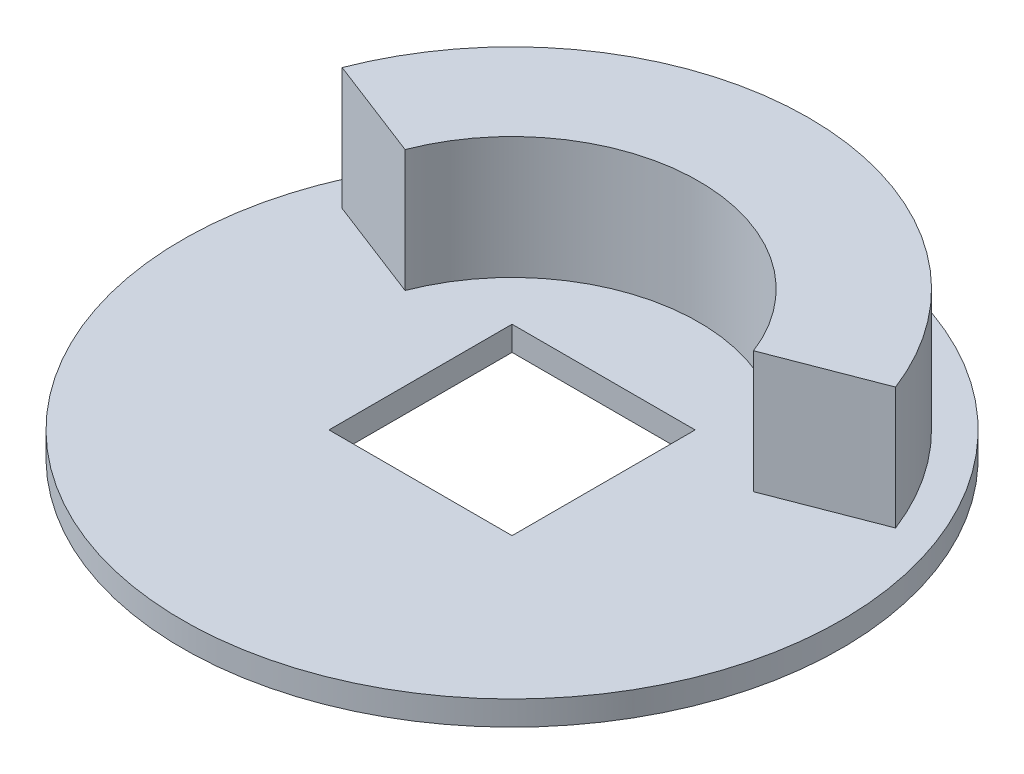
ISO-10303-21;
HEADER;
FILE_DESCRIPTION(('STEP AP214'),'2;1');
FILE_NAME('part.step','',(''),(''),'','','');
FILE_SCHEMA(('AUTOMOTIVE_DESIGN { 1 0 10303 214 1 1 1 1 }'));
ENDSEC;
DATA;
#1=APPLICATION_CONTEXT('core data for automotive mechanical design processes');
#2=APPLICATION_PROTOCOL_DEFINITION('international standard','automotive_design',2000,#1);
#3=PRODUCT_CONTEXT('',#1,'mechanical');
#4=PRODUCT('Part','Part','',(#3));
#5=PRODUCT_RELATED_PRODUCT_CATEGORY('part','',(#4));
#6=PRODUCT_DEFINITION_FORMATION('','',#4);
#7=PRODUCT_DEFINITION_CONTEXT('part definition',#1,'design');
#8=PRODUCT_DEFINITION('design','',#6,#7);
#9=PRODUCT_DEFINITION_SHAPE('','',#8);
#10=(LENGTH_UNIT() NAMED_UNIT(*) SI_UNIT(.MILLI.,.METRE.));
#11=(NAMED_UNIT(*) PLANE_ANGLE_UNIT() SI_UNIT($,.RADIAN.));
#12=(NAMED_UNIT(*) SI_UNIT($,.STERADIAN.) SOLID_ANGLE_UNIT());
#13=UNCERTAINTY_MEASURE_WITH_UNIT(LENGTH_MEASURE(1.E-05),#10,'distance_accuracy_value','');
#14=(GEOMETRIC_REPRESENTATION_CONTEXT(3) GLOBAL_UNCERTAINTY_ASSIGNED_CONTEXT((#13)) GLOBAL_UNIT_ASSIGNED_CONTEXT((#10,
#11,#12)) REPRESENTATION_CONTEXT('',''));
#15=CARTESIAN_POINT('',(0.,0.,0.));
#16=DIRECTION('',(0.,0.,1.));
#17=DIRECTION('',(1.,0.,0.));
#18=AXIS2_PLACEMENT_3D('',#15,#16,#17);
#19=CARTESIAN_POINT('',(-22.6697936745779,10.,-8.75045454545455));
#20=DIRECTION('',(0.36010101010101,0.,-0.932913319941479));
#21=DIRECTION('',(-0.932913319941479,0.,-0.36010101010101));
#22=AXIS2_PLACEMENT_3D('',#19,#20,#21);
#23=PLANE('',#22);
#24=DIRECTION('',(0.932913319941479,0.,0.36010101010101));
#25=VECTOR('',#24,1.);
#26=CARTESIAN_POINT('',(-22.6697936745779,0.,-8.75045454545455));
#27=LINE('',#26,#25);
#28=CARTESIAN_POINT('',(-22.6697936745779,0.,-8.75045454545455));
#29=VERTEX_POINT('',#28);
#30=CARTESIAN_POINT('',(-14.2735737951046,0.,-5.50954545454546));
#31=VERTEX_POINT('',#30);
#32=EDGE_CURVE('E160',#29,#31,#27,.T.);
#33=ORIENTED_EDGE('',*,*,#32,.T.);
#34=DIRECTION('',(0.,-1.,0.));
#35=VECTOR('',#34,1.);
#36=CARTESIAN_POINT('',(-14.2735737951046,10.,-5.50954545454546));
#37=LINE('',#36,#35);
#38=CARTESIAN_POINT('',(-14.2735737951046,10.,-5.50954545454546));
#39=VERTEX_POINT('',#38);
#40=EDGE_CURVE('E11',#39,#31,#37,.T.);
#41=ORIENTED_EDGE('',*,*,#40,.F.);
#42=DIRECTION('',(0.932913319941479,0.,0.36010101010101));
#43=VECTOR('',#42,1.);
#44=CARTESIAN_POINT('',(-22.6697936745779,10.,-8.75045454545455));
#45=LINE('',#44,#43);
#46=CARTESIAN_POINT('',(-22.6697936745779,10.,-8.75045454545455));
#47=VERTEX_POINT('',#46);
#48=EDGE_CURVE('E164',#47,#39,#45,.T.);
#49=ORIENTED_EDGE('',*,*,#48,.F.);
#50=DIRECTION('',(0.,-1.,0.));
#51=VECTOR('',#50,1.);
#52=CARTESIAN_POINT('',(-22.6697936745779,10.,-8.75045454545455));
#53=LINE('',#52,#51);
#54=EDGE_CURVE('E55',#47,#29,#53,.T.);
#55=ORIENTED_EDGE('',*,*,#54,.T.);
#56=EDGE_LOOP('',(#33,#41,#49,#55));
#57=FACE_BOUND('',#56,.T.);
#58=ADVANCED_FACE('F39',(#57),#23,.F.);
#59=CARTESIAN_POINT('',(0.,10.,0.));
#60=DIRECTION('',(0.,-1.,0.));
#61=DIRECTION('',(0.,0.,-1.));
#62=AXIS2_PLACEMENT_3D('',#59,#60,#61);
#63=CYLINDRICAL_SURFACE('',#62,15.3);
#64=CARTESIAN_POINT('',(0.,0.,0.));
#65=DIRECTION('',(0.,-1.,0.));
#66=DIRECTION('',(0.,0.,-1.));
#67=AXIS2_PLACEMENT_3D('',#64,#65,#66);
#68=CIRCLE('',#67,15.3);
#69=CARTESIAN_POINT('',(14.2735737951046,0.,-5.50954545454546));
#70=VERTEX_POINT('',#69);
#71=EDGE_CURVE('E182',#31,#70,#68,.T.);
#72=ORIENTED_EDGE('',*,*,#71,.T.);
#73=DIRECTION('',(0.,-1.,0.));
#74=VECTOR('',#73,1.);
#75=CARTESIAN_POINT('',(14.2735737951046,10.,-5.50954545454546));
#76=LINE('',#75,#74);
#77=CARTESIAN_POINT('',(14.2735737951046,10.,-5.50954545454546));
#78=VERTEX_POINT('',#77);
#79=EDGE_CURVE('E48',#78,#70,#76,.T.);
#80=ORIENTED_EDGE('',*,*,#79,.F.);
#81=CARTESIAN_POINT('',(0.,10.,0.));
#82=DIRECTION('',(0.,-1.,0.));
#83=DIRECTION('',(0.,0.,-1.));
#84=AXIS2_PLACEMENT_3D('',#81,#82,#83);
#85=CIRCLE('',#84,15.3);
#86=EDGE_CURVE('E168',#39,#78,#85,.T.);
#87=ORIENTED_EDGE('',*,*,#86,.F.);
#88=ORIENTED_EDGE('',*,*,#40,.T.);
#89=EDGE_LOOP('',(#72,#80,#87,#88));
#90=FACE_BOUND('',#89,.T.);
#91=ADVANCED_FACE('F205',(#90),#63,.F.);
#92=CARTESIAN_POINT('',(22.6697936745779,10.,-8.75045454545455));
#93=DIRECTION('',(0.36010101010101,0.,0.932913319941479));
#94=DIRECTION('',(0.932913319941479,0.,-0.36010101010101));
#95=AXIS2_PLACEMENT_3D('',#92,#93,#94);
#96=PLANE('',#95);
#97=DIRECTION('',(-0.932913319941479,0.,0.36010101010101));
#98=VECTOR('',#97,1.);
#99=CARTESIAN_POINT('',(22.6697936745779,0.,-8.75045454545455));
#100=LINE('',#99,#98);
#101=CARTESIAN_POINT('',(22.6697936745779,0.,-8.75045454545455));
#102=VERTEX_POINT('',#101);
#103=EDGE_CURVE('E186',#102,#70,#100,.T.);
#104=ORIENTED_EDGE('',*,*,#103,.F.);
#105=DIRECTION('',(0.,-1.,0.));
#106=VECTOR('',#105,1.);
#107=CARTESIAN_POINT('',(22.6697936745779,10.,-8.75045454545455));
#108=LINE('',#107,#106);
#109=CARTESIAN_POINT('',(22.6697936745779,10.,-8.75045454545455));
#110=VERTEX_POINT('',#109);
#111=EDGE_CURVE('E194',#110,#102,#108,.T.);
#112=ORIENTED_EDGE('',*,*,#111,.F.);
#113=DIRECTION('',(-0.932913319941479,0.,0.36010101010101));
#114=VECTOR('',#113,1.);
#115=CARTESIAN_POINT('',(22.6697936745779,10.,-8.75045454545455));
#116=LINE('',#115,#114);
#117=EDGE_CURVE('E172',#110,#78,#116,.T.);
#118=ORIENTED_EDGE('',*,*,#117,.T.);
#119=ORIENTED_EDGE('',*,*,#79,.T.);
#120=EDGE_LOOP('',(#104,#112,#118,#119));
#121=FACE_BOUND('',#120,.T.);
#122=ADVANCED_FACE('F202',(#121),#96,.T.);
#123=CARTESIAN_POINT('',(0.,10.,1.28369537222284E-13));
#124=DIRECTION('',(0.,-1.,0.));
#125=DIRECTION('',(0.,0.,-1.));
#126=AXIS2_PLACEMENT_3D('',#123,#124,#125);
#127=CYLINDRICAL_SURFACE('',#126,24.3);
#128=CARTESIAN_POINT('',(0.,0.,1.28369537222284E-13));
#129=DIRECTION('',(0.,-1.,0.));
#130=DIRECTION('',(0.,0.,-1.));
#131=AXIS2_PLACEMENT_3D('',#128,#129,#130);
#132=CIRCLE('',#131,24.3);
#133=EDGE_CURVE('E169',#29,#102,#132,.T.);
#134=ORIENTED_EDGE('',*,*,#133,.F.);
#135=ORIENTED_EDGE('',*,*,#54,.F.);
#136=CARTESIAN_POINT('',(0.,10.,1.28369537222284E-13));
#137=DIRECTION('',(0.,-1.,0.));
#138=DIRECTION('',(0.,0.,-1.));
#139=AXIS2_PLACEMENT_3D('',#136,#137,#138);
#140=CIRCLE('',#139,24.3);
#141=EDGE_CURVE('E176',#47,#110,#140,.T.);
#142=ORIENTED_EDGE('',*,*,#141,.T.);
#143=ORIENTED_EDGE('',*,*,#111,.T.);
#144=EDGE_LOOP('',(#134,#135,#142,#143));
#145=FACE_BOUND('',#144,.T.);
#146=ADVANCED_FACE('F209',(#145),#127,.T.);
#147=CARTESIAN_POINT('',(0.,10.,0.));
#148=DIRECTION('',(0.,-1.,0.));
#149=DIRECTION('',(0.,0.,-1.));
#150=AXIS2_PLACEMENT_3D('',#147,#148,#149);
#151=PLANE('',#150);
#152=ORIENTED_EDGE('',*,*,#48,.T.);
#153=ORIENTED_EDGE('',*,*,#86,.T.);
#154=ORIENTED_EDGE('',*,*,#117,.F.);
#155=ORIENTED_EDGE('',*,*,#141,.F.);
#156=EDGE_LOOP('',(#152,#153,#154,#155));
#157=FACE_BOUND('',#156,.T.);
#158=ADVANCED_FACE('F212',(#157),#151,.F.);
#159=CARTESIAN_POINT('',(0.,0.,0.));
#160=DIRECTION('',(0.,-1.,0.));
#161=DIRECTION('',(0.,0.,-1.));
#162=AXIS2_PLACEMENT_3D('',#159,#160,#161);
#163=PLANE('',#162);
#164=DIRECTION('',(0.,0.,1.));
#165=VECTOR('',#164,1.);
#166=CARTESIAN_POINT('',(7.5,0.,7.5));
#167=LINE('',#166,#165);
#168=CARTESIAN_POINT('',(7.5,0.,-7.5));
#169=VERTEX_POINT('',#168);
#170=CARTESIAN_POINT('',(7.5,0.,7.5));
#171=VERTEX_POINT('',#170);
#172=EDGE_CURVE('E137',#169,#171,#167,.T.);
#173=ORIENTED_EDGE('',*,*,#172,.T.);
#174=DIRECTION('',(-1.,0.,0.));
#175=VECTOR('',#174,1.);
#176=CARTESIAN_POINT('',(-7.5,0.,7.5));
#177=LINE('',#176,#175);
#178=CARTESIAN_POINT('',(-7.5,0.,7.5));
#179=VERTEX_POINT('',#178);
#180=EDGE_CURVE('E120',#171,#179,#177,.T.);
#181=ORIENTED_EDGE('',*,*,#180,.T.);
#182=DIRECTION('',(0.,0.,-1.));
#183=VECTOR('',#182,1.);
#184=CARTESIAN_POINT('',(-7.5,0.,7.5));
#185=LINE('',#184,#183);
#186=CARTESIAN_POINT('',(-7.5,0.,-7.5));
#187=VERTEX_POINT('',#186);
#188=EDGE_CURVE('E142',#179,#187,#185,.T.);
#189=ORIENTED_EDGE('',*,*,#188,.T.);
#190=DIRECTION('',(1.,0.,0.));
#191=VECTOR('',#190,1.);
#192=CARTESIAN_POINT('',(-7.5,0.,-7.5));
#193=LINE('',#192,#191);
#194=EDGE_CURVE('E114',#187,#169,#193,.T.);
#195=ORIENTED_EDGE('',*,*,#194,.T.);
#196=EDGE_LOOP('',(#173,#181,#189,#195));
#197=FACE_BOUND('',#196,.T.);
#198=CARTESIAN_POINT('',(0.,0.,0.));
#199=DIRECTION('',(0.,-1.,0.));
#200=DIRECTION('',(0.,0.,-1.));
#201=AXIS2_PLACEMENT_3D('',#198,#199,#200);
#202=CIRCLE('',#201,27.);
#203=CARTESIAN_POINT('',(0.,0.,-27.));
#204=VERTEX_POINT('',#203);
#205=EDGE_CURVE('E122',#204,#204,#202,.T.);
#206=ORIENTED_EDGE('',*,*,#205,.F.);
#207=EDGE_LOOP('',(#206));
#208=FACE_BOUND('',#207,.T.);
#209=ORIENTED_EDGE('',*,*,#32,.F.);
#210=ORIENTED_EDGE('',*,*,#133,.T.);
#211=ORIENTED_EDGE('',*,*,#103,.T.);
#212=ORIENTED_EDGE('',*,*,#71,.F.);
#213=EDGE_LOOP('',(#209,#210,#211,#212));
#214=FACE_BOUND('',#213,.T.);
#215=ADVANCED_FACE('F208',(#197,#208,#214),#163,.F.);
#216=CARTESIAN_POINT('',(0.,-2.,0.));
#217=DIRECTION('',(0.,-1.,0.));
#218=DIRECTION('',(0.,0.,-1.));
#219=AXIS2_PLACEMENT_3D('',#216,#217,#218);
#220=PLANE('',#219);
#221=CARTESIAN_POINT('',(0.,-2.,0.));
#222=DIRECTION('',(0.,-1.,0.));
#223=DIRECTION('',(0.,0.,-1.));
#224=AXIS2_PLACEMENT_3D('',#221,#222,#223);
#225=CIRCLE('',#224,27.);
#226=CARTESIAN_POINT('',(0.,-2.,-27.));
#227=VERTEX_POINT('',#226);
#228=EDGE_CURVE('E156',#227,#227,#225,.T.);
#229=ORIENTED_EDGE('',*,*,#228,.T.);
#230=EDGE_LOOP('',(#229));
#231=FACE_BOUND('',#230,.T.);
#232=DIRECTION('',(-1.,0.,0.));
#233=VECTOR('',#232,1.);
#234=CARTESIAN_POINT('',(-7.5,-2.,7.5));
#235=LINE('',#234,#233);
#236=CARTESIAN_POINT('',(7.5,-2.,7.5));
#237=VERTEX_POINT('',#236);
#238=CARTESIAN_POINT('',(-7.5,-2.,7.5));
#239=VERTEX_POINT('',#238);
#240=EDGE_CURVE('E113',#237,#239,#235,.T.);
#241=ORIENTED_EDGE('',*,*,#240,.F.);
#242=DIRECTION('',(0.,0.,1.));
#243=VECTOR('',#242,1.);
#244=CARTESIAN_POINT('',(7.5,-2.,7.5));
#245=LINE('',#244,#243);
#246=CARTESIAN_POINT('',(7.5,-2.,-7.5));
#247=VERTEX_POINT('',#246);
#248=EDGE_CURVE('E102',#247,#237,#245,.T.);
#249=ORIENTED_EDGE('',*,*,#248,.F.);
#250=DIRECTION('',(1.,0.,0.));
#251=VECTOR('',#250,1.);
#252=CARTESIAN_POINT('',(-7.5,-2.,-7.5));
#253=LINE('',#252,#251);
#254=CARTESIAN_POINT('',(-7.5,-2.,-7.5));
#255=VERTEX_POINT('',#254);
#256=EDGE_CURVE('E132',#255,#247,#253,.T.);
#257=ORIENTED_EDGE('',*,*,#256,.F.);
#258=DIRECTION('',(0.,0.,-1.));
#259=VECTOR('',#258,1.);
#260=CARTESIAN_POINT('',(-7.5,-2.,7.5));
#261=LINE('',#260,#259);
#262=EDGE_CURVE('E128',#239,#255,#261,.T.);
#263=ORIENTED_EDGE('',*,*,#262,.F.);
#264=EDGE_LOOP('',(#241,#249,#257,#263));
#265=FACE_BOUND('',#264,.T.);
#266=ADVANCED_FACE('F126',(#231,#265),#220,.T.);
#267=CARTESIAN_POINT('',(0.,-2.,0.));
#268=DIRECTION('',(0.,1.,0.));
#269=DIRECTION('',(0.,0.,1.));
#270=AXIS2_PLACEMENT_3D('',#267,#268,#269);
#271=CYLINDRICAL_SURFACE('',#270,27.);
#272=ORIENTED_EDGE('',*,*,#228,.F.);
#273=EDGE_LOOP('',(#272));
#274=FACE_BOUND('',#273,.T.);
#275=ORIENTED_EDGE('',*,*,#205,.T.);
#276=EDGE_LOOP('',(#275));
#277=FACE_BOUND('',#276,.T.);
#278=ADVANCED_FACE('F227',(#274,#277),#271,.T.);
#279=CARTESIAN_POINT('',(7.5,-2.,7.5));
#280=DIRECTION('',(-1.,0.,0.));
#281=DIRECTION('',(0.,0.,1.));
#282=AXIS2_PLACEMENT_3D('',#279,#280,#281);
#283=PLANE('',#282);
#284=ORIENTED_EDGE('',*,*,#172,.F.);
#285=DIRECTION('',(0.,1.,0.));
#286=VECTOR('',#285,1.);
#287=CARTESIAN_POINT('',(7.5,-2.,-7.5));
#288=LINE('',#287,#286);
#289=EDGE_CURVE('E108',#247,#169,#288,.T.);
#290=ORIENTED_EDGE('',*,*,#289,.F.);
#291=ORIENTED_EDGE('',*,*,#248,.T.);
#292=DIRECTION('',(0.,1.,0.));
#293=VECTOR('',#292,1.);
#294=CARTESIAN_POINT('',(7.5,-2.,7.5));
#295=LINE('',#294,#293);
#296=EDGE_CURVE('E105',#237,#171,#295,.T.);
#297=ORIENTED_EDGE('',*,*,#296,.T.);
#298=EDGE_LOOP('',(#284,#290,#291,#297));
#299=FACE_BOUND('',#298,.T.);
#300=ADVANCED_FACE('F104',(#299),#283,.T.);
#301=CARTESIAN_POINT('',(-7.5,-2.,7.5));
#302=DIRECTION('',(0.,0.,-1.));
#303=DIRECTION('',(-1.,0.,0.));
#304=AXIS2_PLACEMENT_3D('',#301,#302,#303);
#305=PLANE('',#304);
#306=ORIENTED_EDGE('',*,*,#180,.F.);
#307=ORIENTED_EDGE('',*,*,#296,.F.);
#308=ORIENTED_EDGE('',*,*,#240,.T.);
#309=DIRECTION('',(0.,1.,0.));
#310=VECTOR('',#309,1.);
#311=CARTESIAN_POINT('',(-7.5,-2.,7.5));
#312=LINE('',#311,#310);
#313=EDGE_CURVE('E123',#239,#179,#312,.T.);
#314=ORIENTED_EDGE('',*,*,#313,.T.);
#315=EDGE_LOOP('',(#306,#307,#308,#314));
#316=FACE_BOUND('',#315,.T.);
#317=ADVANCED_FACE('F117',(#316),#305,.T.);
#318=CARTESIAN_POINT('',(-7.5,-2.,7.5));
#319=DIRECTION('',(1.,0.,0.));
#320=DIRECTION('',(0.,0.,-1.));
#321=AXIS2_PLACEMENT_3D('',#318,#319,#320);
#322=PLANE('',#321);
#323=ORIENTED_EDGE('',*,*,#188,.F.);
#324=ORIENTED_EDGE('',*,*,#313,.F.);
#325=ORIENTED_EDGE('',*,*,#262,.T.);
#326=DIRECTION('',(0.,1.,0.));
#327=VECTOR('',#326,1.);
#328=CARTESIAN_POINT('',(-7.5,-2.,-7.5));
#329=LINE('',#328,#327);
#330=EDGE_CURVE('E151',#255,#187,#329,.T.);
#331=ORIENTED_EDGE('',*,*,#330,.T.);
#332=EDGE_LOOP('',(#323,#324,#325,#331));
#333=FACE_BOUND('',#332,.T.);
#334=ADVANCED_FACE('F241',(#333),#322,.T.);
#335=CARTESIAN_POINT('',(-7.5,-2.,-7.5));
#336=DIRECTION('',(0.,0.,1.));
#337=DIRECTION('',(1.,0.,0.));
#338=AXIS2_PLACEMENT_3D('',#335,#336,#337);
#339=PLANE('',#338);
#340=ORIENTED_EDGE('',*,*,#194,.F.);
#341=ORIENTED_EDGE('',*,*,#330,.F.);
#342=ORIENTED_EDGE('',*,*,#256,.T.);
#343=ORIENTED_EDGE('',*,*,#289,.T.);
#344=EDGE_LOOP('',(#340,#341,#342,#343));
#345=FACE_BOUND('',#344,.T.);
#346=ADVANCED_FACE('F244',(#345),#339,.T.);
#347=CLOSED_SHELL('',(#58,#91,#122,#146,#158,#215,#266,#278,#300,#317,#334,#346));
#348=MANIFOLD_SOLID_BREP('B2',#347);
#349=ADVANCED_BREP_SHAPE_REPRESENTATION('',(#18,#348),#14);
#350=SHAPE_DEFINITION_REPRESENTATION(#9,#349);
ENDSEC;
END-ISO-10303-21;
